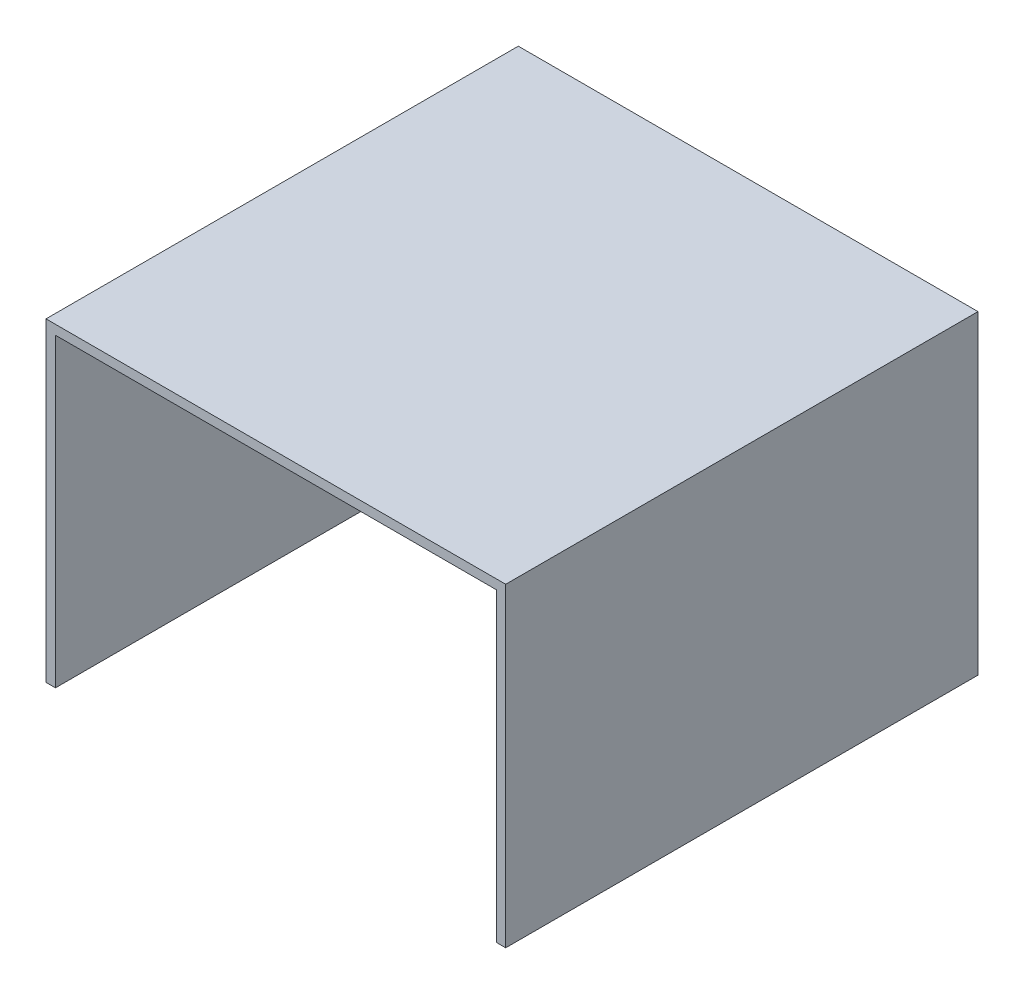
ISO-10303-21;
HEADER;
FILE_DESCRIPTION(('STEP AP214'),'2;1');
FILE_NAME('part.step','',(''),(''),'','','');
FILE_SCHEMA(('AUTOMOTIVE_DESIGN { 1 0 10303 214 1 1 1 1 }'));
ENDSEC;
DATA;
#1=APPLICATION_CONTEXT('core data for automotive mechanical design processes');
#2=APPLICATION_PROTOCOL_DEFINITION('international standard','automotive_design',2000,#1);
#3=PRODUCT_CONTEXT('',#1,'mechanical');
#4=PRODUCT('Part','Part','',(#3));
#5=PRODUCT_RELATED_PRODUCT_CATEGORY('part','',(#4));
#6=PRODUCT_DEFINITION_FORMATION('','',#4);
#7=PRODUCT_DEFINITION_CONTEXT('part definition',#1,'design');
#8=PRODUCT_DEFINITION('design','',#6,#7);
#9=PRODUCT_DEFINITION_SHAPE('','',#8);
#10=(LENGTH_UNIT() NAMED_UNIT(*) SI_UNIT(.MILLI.,.METRE.));
#11=(NAMED_UNIT(*) PLANE_ANGLE_UNIT() SI_UNIT($,.RADIAN.));
#12=(NAMED_UNIT(*) SI_UNIT($,.STERADIAN.) SOLID_ANGLE_UNIT());
#13=UNCERTAINTY_MEASURE_WITH_UNIT(LENGTH_MEASURE(1.E-05),#10,'distance_accuracy_value','');
#14=(GEOMETRIC_REPRESENTATION_CONTEXT(3) GLOBAL_UNCERTAINTY_ASSIGNED_CONTEXT((#13)) GLOBAL_UNIT_ASSIGNED_CONTEXT((#10,
#11,#12)) REPRESENTATION_CONTEXT('',''));
#15=CARTESIAN_POINT('',(0.,0.,0.));
#16=DIRECTION('',(0.,0.,1.));
#17=DIRECTION('',(1.,0.,0.));
#18=AXIS2_PLACEMENT_3D('',#15,#16,#17);
#19=CARTESIAN_POINT('',(35.,23.5,75.));
#20=DIRECTION('',(0.,1.,0.));
#21=DIRECTION('',(-1.,0.,0.));
#22=AXIS2_PLACEMENT_3D('',#19,#20,#21);
#23=PLANE('',#22);
#24=DIRECTION('',(1.,0.,0.));
#25=VECTOR('',#24,1.);
#26=CARTESIAN_POINT('',(35.,23.5,0.));
#27=LINE('',#26,#25);
#28=CARTESIAN_POINT('',(-35.,23.5,0.));
#29=VERTEX_POINT('',#28);
#30=CARTESIAN_POINT('',(35.,23.5,0.));
#31=VERTEX_POINT('',#30);
#32=EDGE_CURVE('E133',#29,#31,#27,.T.);
#33=ORIENTED_EDGE('',*,*,#32,.T.);
#34=DIRECTION('',(0.,0.,-1.));
#35=VECTOR('',#34,1.);
#36=CARTESIAN_POINT('',(35.,23.5,75.));
#37=LINE('',#36,#35);
#38=CARTESIAN_POINT('',(35.,23.5,75.));
#39=VERTEX_POINT('',#38);
#40=EDGE_CURVE('E41',#39,#31,#37,.T.);
#41=ORIENTED_EDGE('',*,*,#40,.F.);
#42=DIRECTION('',(1.,0.,0.));
#43=VECTOR('',#42,1.);
#44=CARTESIAN_POINT('',(35.,23.5,75.));
#45=LINE('',#44,#43);
#46=CARTESIAN_POINT('',(-35.,23.5,75.));
#47=VERTEX_POINT('',#46);
#48=EDGE_CURVE('E93',#47,#39,#45,.T.);
#49=ORIENTED_EDGE('',*,*,#48,.F.);
#50=DIRECTION('',(0.,0.,-1.));
#51=VECTOR('',#50,1.);
#52=CARTESIAN_POINT('',(-35.,23.5,75.));
#53=LINE('',#52,#51);
#54=EDGE_CURVE('E11',#47,#29,#53,.T.);
#55=ORIENTED_EDGE('',*,*,#54,.T.);
#56=EDGE_LOOP('',(#33,#41,#49,#55));
#57=FACE_BOUND('',#56,.T.);
#58=ADVANCED_FACE('F33',(#57),#23,.F.);
#59=CARTESIAN_POINT('',(35.,-23.5,75.));
#60=DIRECTION('',(1.,0.,0.));
#61=DIRECTION('',(0.,0.,-1.));
#62=AXIS2_PLACEMENT_3D('',#59,#60,#61);
#63=PLANE('',#62);
#64=DIRECTION('',(0.,-1.,0.));
#65=VECTOR('',#64,1.);
#66=CARTESIAN_POINT('',(35.,-23.5,0.));
#67=LINE('',#66,#65);
#68=CARTESIAN_POINT('',(35.,-25.,0.));
#69=VERTEX_POINT('',#68);
#70=EDGE_CURVE('E136',#31,#69,#67,.T.);
#71=ORIENTED_EDGE('',*,*,#70,.T.);
#72=DIRECTION('',(0.,0.,-1.));
#73=VECTOR('',#72,1.);
#74=CARTESIAN_POINT('',(35.,-25.,75.));
#75=LINE('',#74,#73);
#76=CARTESIAN_POINT('',(35.,-25.,75.));
#77=VERTEX_POINT('',#76);
#78=EDGE_CURVE('E153',#77,#69,#75,.T.);
#79=ORIENTED_EDGE('',*,*,#78,.F.);
#80=DIRECTION('',(0.,-1.,0.));
#81=VECTOR('',#80,1.);
#82=CARTESIAN_POINT('',(35.,-23.5,75.));
#83=LINE('',#82,#81);
#84=EDGE_CURVE('E160',#39,#77,#83,.T.);
#85=ORIENTED_EDGE('',*,*,#84,.F.);
#86=ORIENTED_EDGE('',*,*,#40,.T.);
#87=EDGE_LOOP('',(#71,#79,#85,#86));
#88=FACE_BOUND('',#87,.T.);
#89=ADVANCED_FACE('F158',(#88),#63,.F.);
#90=CARTESIAN_POINT('',(36.5,-25.,75.));
#91=DIRECTION('',(0.,1.,0.));
#92=DIRECTION('',(0.,0.,1.));
#93=AXIS2_PLACEMENT_3D('',#90,#91,#92);
#94=PLANE('',#93);
#95=DIRECTION('',(1.,0.,0.));
#96=VECTOR('',#95,1.);
#97=CARTESIAN_POINT('',(36.5,-25.,0.));
#98=LINE('',#97,#96);
#99=CARTESIAN_POINT('',(36.5,-25.,0.));
#100=VERTEX_POINT('',#99);
#101=EDGE_CURVE('E138',#69,#100,#98,.T.);
#102=ORIENTED_EDGE('',*,*,#101,.T.);
#103=DIRECTION('',(0.,0.,-1.));
#104=VECTOR('',#103,1.);
#105=CARTESIAN_POINT('',(36.5,-25.,75.));
#106=LINE('',#105,#104);
#107=CARTESIAN_POINT('',(36.5,-25.,75.));
#108=VERTEX_POINT('',#107);
#109=EDGE_CURVE('E150',#108,#100,#106,.T.);
#110=ORIENTED_EDGE('',*,*,#109,.F.);
#111=DIRECTION('',(1.,0.,0.));
#112=VECTOR('',#111,1.);
#113=CARTESIAN_POINT('',(36.5,-25.,75.));
#114=LINE('',#113,#112);
#115=EDGE_CURVE('E173',#77,#108,#114,.T.);
#116=ORIENTED_EDGE('',*,*,#115,.F.);
#117=ORIENTED_EDGE('',*,*,#78,.T.);
#118=EDGE_LOOP('',(#102,#110,#116,#117));
#119=FACE_BOUND('',#118,.T.);
#120=ADVANCED_FACE('F169',(#119),#94,.F.);
#121=CARTESIAN_POINT('',(36.5,-25.,75.));
#122=DIRECTION('',(-1.,0.,0.));
#123=DIRECTION('',(0.,0.,1.));
#124=AXIS2_PLACEMENT_3D('',#121,#122,#123);
#125=PLANE('',#124);
#126=DIRECTION('',(0.,1.,0.));
#127=VECTOR('',#126,1.);
#128=CARTESIAN_POINT('',(36.5,-25.,0.));
#129=LINE('',#128,#127);
#130=CARTESIAN_POINT('',(36.5,25.,0.));
#131=VERTEX_POINT('',#130);
#132=EDGE_CURVE('E140',#100,#131,#129,.T.);
#133=ORIENTED_EDGE('',*,*,#132,.T.);
#134=DIRECTION('',(0.,0.,-1.));
#135=VECTOR('',#134,1.);
#136=CARTESIAN_POINT('',(36.5,25.,75.));
#137=LINE('',#136,#135);
#138=CARTESIAN_POINT('',(36.5,25.,75.));
#139=VERTEX_POINT('',#138);
#140=EDGE_CURVE('E122',#139,#131,#137,.T.);
#141=ORIENTED_EDGE('',*,*,#140,.F.);
#142=DIRECTION('',(0.,1.,0.));
#143=VECTOR('',#142,1.);
#144=CARTESIAN_POINT('',(36.5,-25.,75.));
#145=LINE('',#144,#143);
#146=EDGE_CURVE('E113',#108,#139,#145,.T.);
#147=ORIENTED_EDGE('',*,*,#146,.F.);
#148=ORIENTED_EDGE('',*,*,#109,.T.);
#149=EDGE_LOOP('',(#133,#141,#147,#148));
#150=FACE_BOUND('',#149,.T.);
#151=ADVANCED_FACE('F172',(#150),#125,.F.);
#152=CARTESIAN_POINT('',(36.5,25.,75.));
#153=DIRECTION('',(0.,-1.,0.));
#154=DIRECTION('',(1.,0.,0.));
#155=AXIS2_PLACEMENT_3D('',#152,#153,#154);
#156=PLANE('',#155);
#157=DIRECTION('',(-1.,0.,0.));
#158=VECTOR('',#157,1.);
#159=CARTESIAN_POINT('',(36.5,25.,0.));
#160=LINE('',#159,#158);
#161=CARTESIAN_POINT('',(-36.5,25.,0.));
#162=VERTEX_POINT('',#161);
#163=EDGE_CURVE('E121',#131,#162,#160,.T.);
#164=ORIENTED_EDGE('',*,*,#163,.T.);
#165=DIRECTION('',(0.,0.,-1.));
#166=VECTOR('',#165,1.);
#167=CARTESIAN_POINT('',(-36.5,25.,75.));
#168=LINE('',#167,#166);
#169=CARTESIAN_POINT('',(-36.5,25.,75.));
#170=VERTEX_POINT('',#169);
#171=EDGE_CURVE('E118',#170,#162,#168,.T.);
#172=ORIENTED_EDGE('',*,*,#171,.F.);
#173=DIRECTION('',(-1.,0.,0.));
#174=VECTOR('',#173,1.);
#175=CARTESIAN_POINT('',(36.5,25.,75.));
#176=LINE('',#175,#174);
#177=EDGE_CURVE('E107',#139,#170,#176,.T.);
#178=ORIENTED_EDGE('',*,*,#177,.F.);
#179=ORIENTED_EDGE('',*,*,#140,.T.);
#180=EDGE_LOOP('',(#164,#172,#178,#179));
#181=FACE_BOUND('',#180,.T.);
#182=ADVANCED_FACE('F119',(#181),#156,.F.);
#183=CARTESIAN_POINT('',(-36.5,-25.,75.));
#184=DIRECTION('',(1.,0.,0.));
#185=DIRECTION('',(0.,0.,-1.));
#186=AXIS2_PLACEMENT_3D('',#183,#184,#185);
#187=PLANE('',#186);
#188=DIRECTION('',(0.,-1.,0.));
#189=VECTOR('',#188,1.);
#190=CARTESIAN_POINT('',(-36.5,-25.,0.));
#191=LINE('',#190,#189);
#192=CARTESIAN_POINT('',(-36.5,-25.,0.));
#193=VERTEX_POINT('',#192);
#194=EDGE_CURVE('E79',#162,#193,#191,.T.);
#195=ORIENTED_EDGE('',*,*,#194,.T.);
#196=DIRECTION('',(0.,0.,-1.));
#197=VECTOR('',#196,1.);
#198=CARTESIAN_POINT('',(-36.5,-25.,75.));
#199=LINE('',#198,#197);
#200=CARTESIAN_POINT('',(-36.5,-25.,75.));
#201=VERTEX_POINT('',#200);
#202=EDGE_CURVE('E123',#201,#193,#199,.T.);
#203=ORIENTED_EDGE('',*,*,#202,.F.);
#204=DIRECTION('',(0.,-1.,0.));
#205=VECTOR('',#204,1.);
#206=CARTESIAN_POINT('',(-36.5,-25.,75.));
#207=LINE('',#206,#205);
#208=EDGE_CURVE('E111',#170,#201,#207,.T.);
#209=ORIENTED_EDGE('',*,*,#208,.F.);
#210=ORIENTED_EDGE('',*,*,#171,.T.);
#211=EDGE_LOOP('',(#195,#203,#209,#210));
#212=FACE_BOUND('',#211,.T.);
#213=ADVANCED_FACE('F125',(#212),#187,.F.);
#214=CARTESIAN_POINT('',(-35.,-25.,75.));
#215=DIRECTION('',(0.,1.,0.));
#216=DIRECTION('',(0.,0.,1.));
#217=AXIS2_PLACEMENT_3D('',#214,#215,#216);
#218=PLANE('',#217);
#219=DIRECTION('',(1.,0.,0.));
#220=VECTOR('',#219,1.);
#221=CARTESIAN_POINT('',(-35.,-25.,0.));
#222=LINE('',#221,#220);
#223=CARTESIAN_POINT('',(-35.,-25.,0.));
#224=VERTEX_POINT('',#223);
#225=EDGE_CURVE('E86',#193,#224,#222,.T.);
#226=ORIENTED_EDGE('',*,*,#225,.T.);
#227=DIRECTION('',(0.,0.,-1.));
#228=VECTOR('',#227,1.);
#229=CARTESIAN_POINT('',(-35.,-25.,75.));
#230=LINE('',#229,#228);
#231=CARTESIAN_POINT('',(-35.,-25.,75.));
#232=VERTEX_POINT('',#231);
#233=EDGE_CURVE('E129',#232,#224,#230,.T.);
#234=ORIENTED_EDGE('',*,*,#233,.F.);
#235=DIRECTION('',(1.,0.,0.));
#236=VECTOR('',#235,1.);
#237=CARTESIAN_POINT('',(-35.,-25.,75.));
#238=LINE('',#237,#236);
#239=EDGE_CURVE('E127',#201,#232,#238,.T.);
#240=ORIENTED_EDGE('',*,*,#239,.F.);
#241=ORIENTED_EDGE('',*,*,#202,.T.);
#242=EDGE_LOOP('',(#226,#234,#240,#241));
#243=FACE_BOUND('',#242,.T.);
#244=ADVANCED_FACE('F179',(#243),#218,.F.);
#245=CARTESIAN_POINT('',(-35.,-23.5,75.));
#246=DIRECTION('',(-1.,0.,0.));
#247=DIRECTION('',(0.,0.,1.));
#248=AXIS2_PLACEMENT_3D('',#245,#246,#247);
#249=PLANE('',#248);
#250=DIRECTION('',(0.,1.,0.));
#251=VECTOR('',#250,1.);
#252=CARTESIAN_POINT('',(-35.,-23.5,0.));
#253=LINE('',#252,#251);
#254=EDGE_CURVE('E145',#224,#29,#253,.T.);
#255=ORIENTED_EDGE('',*,*,#254,.T.);
#256=ORIENTED_EDGE('',*,*,#54,.F.);
#257=DIRECTION('',(0.,1.,0.));
#258=VECTOR('',#257,1.);
#259=CARTESIAN_POINT('',(-35.,-23.5,75.));
#260=LINE('',#259,#258);
#261=EDGE_CURVE('E49',#232,#47,#260,.T.);
#262=ORIENTED_EDGE('',*,*,#261,.F.);
#263=ORIENTED_EDGE('',*,*,#233,.T.);
#264=EDGE_LOOP('',(#255,#256,#262,#263));
#265=FACE_BOUND('',#264,.T.);
#266=ADVANCED_FACE('F178',(#265),#249,.F.);
#267=CARTESIAN_POINT('',(0.,0.,75.));
#268=DIRECTION('',(0.,0.,1.));
#269=DIRECTION('',(1.,0.,0.));
#270=AXIS2_PLACEMENT_3D('',#267,#268,#269);
#271=PLANE('',#270);
#272=ORIENTED_EDGE('',*,*,#261,.T.);
#273=ORIENTED_EDGE('',*,*,#48,.T.);
#274=ORIENTED_EDGE('',*,*,#84,.T.);
#275=ORIENTED_EDGE('',*,*,#115,.T.);
#276=ORIENTED_EDGE('',*,*,#146,.T.);
#277=ORIENTED_EDGE('',*,*,#177,.T.);
#278=ORIENTED_EDGE('',*,*,#208,.T.);
#279=ORIENTED_EDGE('',*,*,#239,.T.);
#280=EDGE_LOOP('',(#272,#273,#274,#275,#276,#277,#278,#279));
#281=FACE_BOUND('',#280,.T.);
#282=ADVANCED_FACE('F109',(#281),#271,.T.);
#283=CARTESIAN_POINT('',(0.,0.,0.));
#284=DIRECTION('',(0.,0.,1.));
#285=DIRECTION('',(1.,0.,0.));
#286=AXIS2_PLACEMENT_3D('',#283,#284,#285);
#287=PLANE('',#286);
#288=ORIENTED_EDGE('',*,*,#32,.F.);
#289=ORIENTED_EDGE('',*,*,#254,.F.);
#290=ORIENTED_EDGE('',*,*,#225,.F.);
#291=ORIENTED_EDGE('',*,*,#194,.F.);
#292=ORIENTED_EDGE('',*,*,#163,.F.);
#293=ORIENTED_EDGE('',*,*,#132,.F.);
#294=ORIENTED_EDGE('',*,*,#101,.F.);
#295=ORIENTED_EDGE('',*,*,#70,.F.);
#296=EDGE_LOOP('',(#288,#289,#290,#291,#292,#293,#294,#295));
#297=FACE_BOUND('',#296,.T.);
#298=ADVANCED_FACE('F164',(#297),#287,.F.);
#299=CLOSED_SHELL('',(#58,#89,#120,#151,#182,#213,#244,#266,#282,#298));
#300=MANIFOLD_SOLID_BREP('B2',#299);
#301=ADVANCED_BREP_SHAPE_REPRESENTATION('',(#18,#300),#14);
#302=SHAPE_DEFINITION_REPRESENTATION(#9,#301);
ENDSEC;
END-ISO-10303-21;
